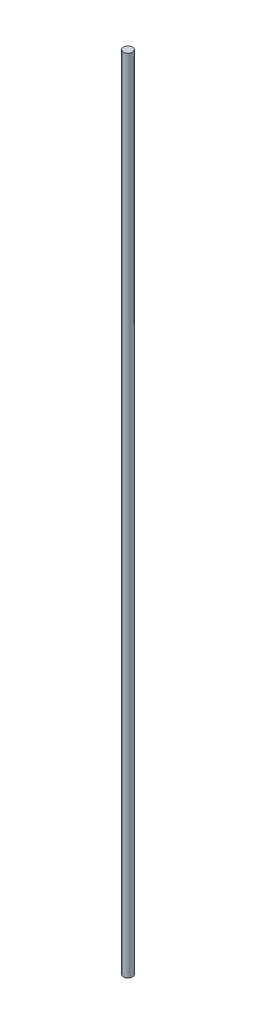
ISO-10303-21;
HEADER;
FILE_DESCRIPTION(('STEP AP214'),'2;1');
FILE_NAME('part.step','',(''),(''),'','','');
FILE_SCHEMA(('AUTOMOTIVE_DESIGN { 1 0 10303 214 1 1 1 1 }'));
ENDSEC;
DATA;
#1=APPLICATION_CONTEXT('core data for automotive mechanical design processes');
#2=APPLICATION_PROTOCOL_DEFINITION('international standard','automotive_design',2000,#1);
#3=PRODUCT_CONTEXT('',#1,'mechanical');
#4=PRODUCT('Part','Part','',(#3));
#5=PRODUCT_RELATED_PRODUCT_CATEGORY('part','',(#4));
#6=PRODUCT_DEFINITION_FORMATION('','',#4);
#7=PRODUCT_DEFINITION_CONTEXT('part definition',#1,'design');
#8=PRODUCT_DEFINITION('design','',#6,#7);
#9=PRODUCT_DEFINITION_SHAPE('','',#8);
#10=(LENGTH_UNIT() NAMED_UNIT(*) SI_UNIT(.MILLI.,.METRE.));
#11=(NAMED_UNIT(*) PLANE_ANGLE_UNIT() SI_UNIT($,.RADIAN.));
#12=(NAMED_UNIT(*) SI_UNIT($,.STERADIAN.) SOLID_ANGLE_UNIT());
#13=UNCERTAINTY_MEASURE_WITH_UNIT(LENGTH_MEASURE(1.E-05),#10,'distance_accuracy_value','');
#14=(GEOMETRIC_REPRESENTATION_CONTEXT(3) GLOBAL_UNCERTAINTY_ASSIGNED_CONTEXT((#13)) GLOBAL_UNIT_ASSIGNED_CONTEXT((#10,
#11,#12)) REPRESENTATION_CONTEXT('',''));
#15=CARTESIAN_POINT('',(0.,0.,0.));
#16=DIRECTION('',(0.,0.,1.));
#17=DIRECTION('',(1.,0.,0.));
#18=AXIS2_PLACEMENT_3D('',#15,#16,#17);
#19=CARTESIAN_POINT('',(0.,556.,0.));
#20=DIRECTION('',(0.,-1.,0.));
#21=DIRECTION('',(0.,0.,-1.));
#22=AXIS2_PLACEMENT_3D('',#19,#20,#21);
#23=CYLINDRICAL_SURFACE('',#22,3.1);
#24=CARTESIAN_POINT('',(0.,556.,0.));
#25=DIRECTION('',(0.,1.,0.));
#26=DIRECTION('',(0.,0.,1.));
#27=AXIS2_PLACEMENT_3D('',#24,#25,#26);
#28=CIRCLE('',#27,3.1);
#29=CARTESIAN_POINT('',(0.,556.,3.1));
#30=VERTEX_POINT('',#29);
#31=EDGE_CURVE('E10',#30,#30,#28,.T.);
#32=ORIENTED_EDGE('',*,*,#31,.F.);
#33=EDGE_LOOP('',(#32));
#34=FACE_BOUND('',#33,.T.);
#35=CARTESIAN_POINT('',(0.,0.,0.));
#36=DIRECTION('',(0.,1.,0.));
#37=DIRECTION('',(0.,0.,1.));
#38=AXIS2_PLACEMENT_3D('',#35,#36,#37);
#39=CIRCLE('',#38,3.1);
#40=CARTESIAN_POINT('',(0.,0.,3.1));
#41=VERTEX_POINT('',#40);
#42=EDGE_CURVE('E37',#41,#41,#39,.T.);
#43=ORIENTED_EDGE('',*,*,#42,.T.);
#44=EDGE_LOOP('',(#43));
#45=FACE_BOUND('',#44,.T.);
#46=ADVANCED_FACE('F40',(#34,#45),#23,.T.);
#47=CARTESIAN_POINT('',(0.,556.,0.));
#48=DIRECTION('',(0.,1.,0.));
#49=DIRECTION('',(0.,0.,1.));
#50=AXIS2_PLACEMENT_3D('',#47,#48,#49);
#51=PLANE('',#50);
#52=ORIENTED_EDGE('',*,*,#31,.T.);
#53=EDGE_LOOP('',(#52));
#54=FACE_BOUND('',#53,.T.);
#55=ADVANCED_FACE('F55',(#54),#51,.T.);
#56=CARTESIAN_POINT('',(0.,0.,0.));
#57=DIRECTION('',(0.,1.,0.));
#58=DIRECTION('',(0.,0.,1.));
#59=AXIS2_PLACEMENT_3D('',#56,#57,#58);
#60=PLANE('',#59);
#61=ORIENTED_EDGE('',*,*,#42,.F.);
#62=EDGE_LOOP('',(#61));
#63=FACE_BOUND('',#62,.T.);
#64=ADVANCED_FACE('F49',(#63),#60,.F.);
#65=CLOSED_SHELL('',(#46,#55,#64));
#66=MANIFOLD_SOLID_BREP('B2',#65);
#67=ADVANCED_BREP_SHAPE_REPRESENTATION('',(#18,#66),#14);
#68=SHAPE_DEFINITION_REPRESENTATION(#9,#67);
ENDSEC;
END-ISO-10303-21;
